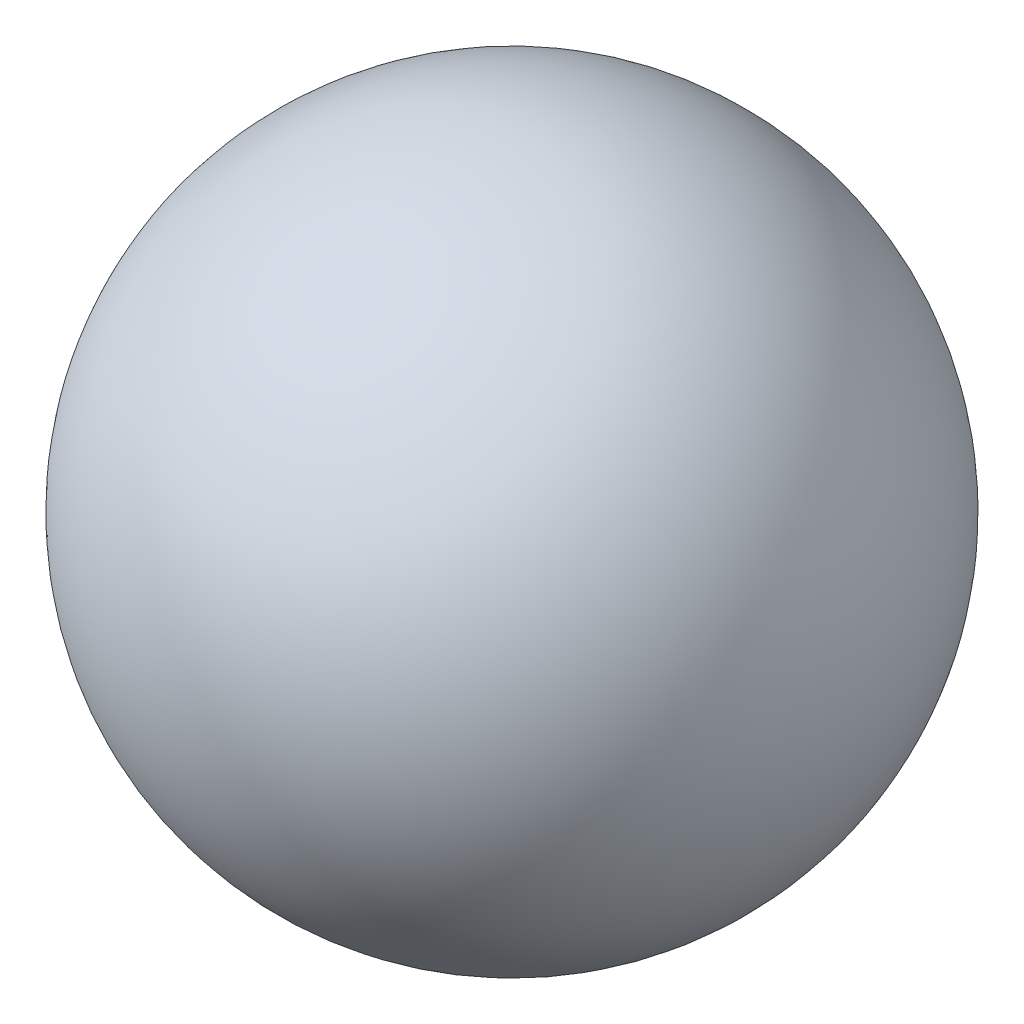
ISO-10303-21;
HEADER;
FILE_DESCRIPTION(('STEP AP214'),'2;1');
FILE_NAME('part.step','',(''),(''),'','','');
FILE_SCHEMA(('AUTOMOTIVE_DESIGN { 1 0 10303 214 1 1 1 1 }'));
ENDSEC;
DATA;
#1=APPLICATION_CONTEXT('core data for automotive mechanical design processes');
#2=APPLICATION_PROTOCOL_DEFINITION('international standard','automotive_design',2000,#1);
#3=PRODUCT_CONTEXT('',#1,'mechanical');
#4=PRODUCT('Part','Part','',(#3));
#5=PRODUCT_RELATED_PRODUCT_CATEGORY('part','',(#4));
#6=PRODUCT_DEFINITION_FORMATION('','',#4);
#7=PRODUCT_DEFINITION_CONTEXT('part definition',#1,'design');
#8=PRODUCT_DEFINITION('design','',#6,#7);
#9=PRODUCT_DEFINITION_SHAPE('','',#8);
#10=(LENGTH_UNIT() NAMED_UNIT(*) SI_UNIT(.MILLI.,.METRE.));
#11=(NAMED_UNIT(*) PLANE_ANGLE_UNIT() SI_UNIT($,.RADIAN.));
#12=(NAMED_UNIT(*) SI_UNIT($,.STERADIAN.) SOLID_ANGLE_UNIT());
#13=UNCERTAINTY_MEASURE_WITH_UNIT(LENGTH_MEASURE(1.E-05),#10,'distance_accuracy_value','');
#14=(GEOMETRIC_REPRESENTATION_CONTEXT(3) GLOBAL_UNCERTAINTY_ASSIGNED_CONTEXT((#13)) GLOBAL_UNIT_ASSIGNED_CONTEXT((#10,
#11,#12)) REPRESENTATION_CONTEXT('',''));
#15=CARTESIAN_POINT('',(0.,0.,0.));
#16=DIRECTION('',(0.,0.,1.));
#17=DIRECTION('',(1.,0.,0.));
#18=AXIS2_PLACEMENT_3D('',#15,#16,#17);
#19=CARTESIAN_POINT('',(0.,0.,0.));
#20=DIRECTION('',(-1.,0.,0.));
#21=DIRECTION('',(0.,-1.,0.));
#22=AXIS2_PLACEMENT_3D('',#19,#20,#21);
#23=SPHERICAL_SURFACE('',#22,88.);
#24=CARTESIAN_POINT('',(-88.,0.,0.));
#25=VERTEX_POINT('',#24);
#26=VERTEX_LOOP('',#25);
#27=FACE_BOUND('',#26,.T.);
#28=ADVANCED_FACE('F30',(#27),#23,.T.);
#29=CLOSED_SHELL('',(#28));
#30=CARTESIAN_POINT('',(0.,0.,0.));
#31=DIRECTION('',(-1.,0.,0.));
#32=DIRECTION('',(0.,-1.,0.));
#33=AXIS2_PLACEMENT_3D('',#30,#31,#32);
#34=SPHERICAL_SURFACE('',#33,87.);
#35=CARTESIAN_POINT('',(-87.,0.,0.));
#36=VERTEX_POINT('',#35);
#37=VERTEX_LOOP('',#36);
#38=FACE_BOUND('',#37,.T.);
#39=ADVANCED_FACE('F32',(#38),#34,.F.);
#40=CLOSED_SHELL('',(#39));
#41=ORIENTED_CLOSED_SHELL('',*,#40,.T.);
#42=BREP_WITH_VOIDS('B2',#29,(#41));
#43=ADVANCED_BREP_SHAPE_REPRESENTATION('',(#18,#42),#14);
#44=SHAPE_DEFINITION_REPRESENTATION(#9,#43);
ENDSEC;
END-ISO-10303-21;
